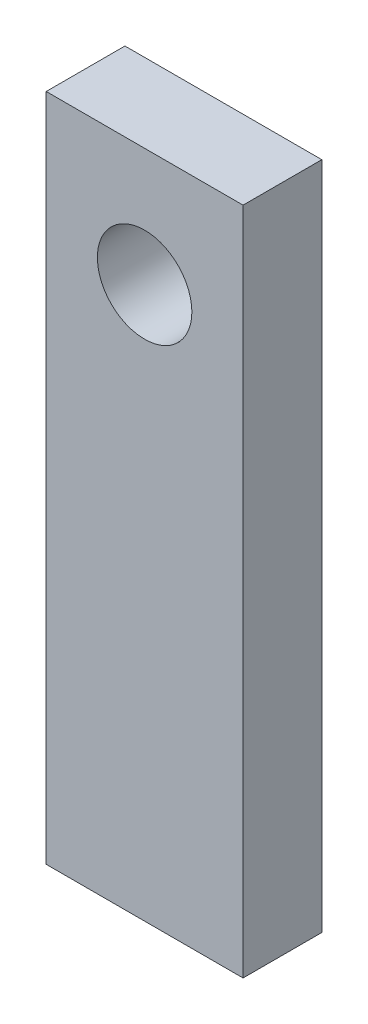
ISO-10303-21;
HEADER;
FILE_DESCRIPTION(('STEP AP214'),'2;1');
FILE_NAME('part.step','',(''),(''),'','','');
FILE_SCHEMA(('AUTOMOTIVE_DESIGN { 1 0 10303 214 1 1 1 1 }'));
ENDSEC;
DATA;
#1=APPLICATION_CONTEXT('core data for automotive mechanical design processes');
#2=APPLICATION_PROTOCOL_DEFINITION('international standard','automotive_design',2000,#1);
#3=PRODUCT_CONTEXT('',#1,'mechanical');
#4=PRODUCT('Part','Part','',(#3));
#5=PRODUCT_RELATED_PRODUCT_CATEGORY('part','',(#4));
#6=PRODUCT_DEFINITION_FORMATION('','',#4);
#7=PRODUCT_DEFINITION_CONTEXT('part definition',#1,'design');
#8=PRODUCT_DEFINITION('design','',#6,#7);
#9=PRODUCT_DEFINITION_SHAPE('','',#8);
#10=(LENGTH_UNIT() NAMED_UNIT(*) SI_UNIT(.MILLI.,.METRE.));
#11=(NAMED_UNIT(*) PLANE_ANGLE_UNIT() SI_UNIT($,.RADIAN.));
#12=(NAMED_UNIT(*) SI_UNIT($,.STERADIAN.) SOLID_ANGLE_UNIT());
#13=UNCERTAINTY_MEASURE_WITH_UNIT(LENGTH_MEASURE(1.E-05),#10,'distance_accuracy_value','');
#14=(GEOMETRIC_REPRESENTATION_CONTEXT(3) GLOBAL_UNCERTAINTY_ASSIGNED_CONTEXT((#13)) GLOBAL_UNIT_ASSIGNED_CONTEXT((#10,
#11,#12)) REPRESENTATION_CONTEXT('',''));
#15=CARTESIAN_POINT('',(0.,0.,0.));
#16=DIRECTION('',(0.,0.,1.));
#17=DIRECTION('',(1.,0.,0.));
#18=AXIS2_PLACEMENT_3D('',#15,#16,#17);
#19=CARTESIAN_POINT('',(0.,85.,0.));
#20=DIRECTION('',(1.,0.,0.));
#21=DIRECTION('',(0.,0.,-1.));
#22=AXIS2_PLACEMENT_3D('',#19,#20,#21);
#23=PLANE('',#22);
#24=DIRECTION('',(0.,0.,1.));
#25=VECTOR('',#24,1.);
#26=CARTESIAN_POINT('',(0.,0.,0.));
#27=LINE('',#26,#25);
#28=CARTESIAN_POINT('',(0.,0.,-10.));
#29=VERTEX_POINT('',#28);
#30=CARTESIAN_POINT('',(0.,0.,0.));
#31=VERTEX_POINT('',#30);
#32=EDGE_CURVE('E124',#29,#31,#27,.T.);
#33=ORIENTED_EDGE('',*,*,#32,.T.);
#34=DIRECTION('',(0.,-1.,0.));
#35=VECTOR('',#34,1.);
#36=CARTESIAN_POINT('',(0.,85.,0.));
#37=LINE('',#36,#35);
#38=CARTESIAN_POINT('',(0.,85.,0.));
#39=VERTEX_POINT('',#38);
#40=EDGE_CURVE('E11',#39,#31,#37,.T.);
#41=ORIENTED_EDGE('',*,*,#40,.F.);
#42=DIRECTION('',(0.,0.,1.));
#43=VECTOR('',#42,1.);
#44=CARTESIAN_POINT('',(0.,85.,0.));
#45=LINE('',#44,#43);
#46=CARTESIAN_POINT('',(0.,85.,-10.));
#47=VERTEX_POINT('',#46);
#48=EDGE_CURVE('E127',#47,#39,#45,.T.);
#49=ORIENTED_EDGE('',*,*,#48,.F.);
#50=DIRECTION('',(0.,-1.,0.));
#51=VECTOR('',#50,1.);
#52=CARTESIAN_POINT('',(0.,85.,-10.));
#53=LINE('',#52,#51);
#54=EDGE_CURVE('E133',#47,#29,#53,.T.);
#55=ORIENTED_EDGE('',*,*,#54,.T.);
#56=EDGE_LOOP('',(#33,#41,#49,#55));
#57=FACE_BOUND('',#56,.T.);
#58=ADVANCED_FACE('F45',(#57),#23,.F.);
#59=CARTESIAN_POINT('',(0.,85.,0.));
#60=DIRECTION('',(0.,0.,-1.));
#61=DIRECTION('',(-1.,0.,0.));
#62=AXIS2_PLACEMENT_3D('',#59,#60,#61);
#63=PLANE('',#62);
#64=CARTESIAN_POINT('',(12.5,70.,0.));
#65=DIRECTION('',(0.,0.,1.));
#66=DIRECTION('',(1.,0.,0.));
#67=AXIS2_PLACEMENT_3D('',#64,#65,#66);
#68=CIRCLE('',#67,6.);
#69=CARTESIAN_POINT('',(18.5,70.,0.));
#70=VERTEX_POINT('',#69);
#71=EDGE_CURVE('E120',#70,#70,#68,.T.);
#72=ORIENTED_EDGE('',*,*,#71,.F.);
#73=EDGE_LOOP('',(#72));
#74=FACE_BOUND('',#73,.T.);
#75=DIRECTION('',(1.,0.,0.));
#76=VECTOR('',#75,1.);
#77=CARTESIAN_POINT('',(0.,0.,0.));
#78=LINE('',#77,#76);
#79=CARTESIAN_POINT('',(25.,0.,0.));
#80=VERTEX_POINT('',#79);
#81=EDGE_CURVE('E136',#31,#80,#78,.T.);
#82=ORIENTED_EDGE('',*,*,#81,.T.);
#83=DIRECTION('',(0.,-1.,0.));
#84=VECTOR('',#83,1.);
#85=CARTESIAN_POINT('',(25.,85.,0.));
#86=LINE('',#85,#84);
#87=CARTESIAN_POINT('',(25.,85.,0.));
#88=VERTEX_POINT('',#87);
#89=EDGE_CURVE('E53',#88,#80,#86,.T.);
#90=ORIENTED_EDGE('',*,*,#89,.F.);
#91=DIRECTION('',(1.,0.,0.));
#92=VECTOR('',#91,1.);
#93=CARTESIAN_POINT('',(0.,85.,0.));
#94=LINE('',#93,#92);
#95=EDGE_CURVE('E92',#39,#88,#94,.T.);
#96=ORIENTED_EDGE('',*,*,#95,.F.);
#97=ORIENTED_EDGE('',*,*,#40,.T.);
#98=EDGE_LOOP('',(#82,#90,#96,#97));
#99=FACE_BOUND('',#98,.T.);
#100=ADVANCED_FACE('F162',(#74,#99),#63,.F.);
#101=CARTESIAN_POINT('',(25.,85.,0.));
#102=DIRECTION('',(-1.,0.,0.));
#103=DIRECTION('',(0.,0.,1.));
#104=AXIS2_PLACEMENT_3D('',#101,#102,#103);
#105=PLANE('',#104);
#106=DIRECTION('',(0.,0.,-1.));
#107=VECTOR('',#106,1.);
#108=CARTESIAN_POINT('',(25.,0.,0.));
#109=LINE('',#108,#107);
#110=CARTESIAN_POINT('',(25.,0.,-10.));
#111=VERTEX_POINT('',#110);
#112=EDGE_CURVE('E79',#80,#111,#109,.T.);
#113=ORIENTED_EDGE('',*,*,#112,.T.);
#114=DIRECTION('',(0.,-1.,0.));
#115=VECTOR('',#114,1.);
#116=CARTESIAN_POINT('',(25.,85.,-10.));
#117=LINE('',#116,#115);
#118=CARTESIAN_POINT('',(25.,85.,-10.));
#119=VERTEX_POINT('',#118);
#120=EDGE_CURVE('E141',#119,#111,#117,.T.);
#121=ORIENTED_EDGE('',*,*,#120,.F.);
#122=DIRECTION('',(0.,0.,-1.));
#123=VECTOR('',#122,1.);
#124=CARTESIAN_POINT('',(25.,85.,0.));
#125=LINE('',#124,#123);
#126=EDGE_CURVE('E130',#88,#119,#125,.T.);
#127=ORIENTED_EDGE('',*,*,#126,.F.);
#128=ORIENTED_EDGE('',*,*,#89,.T.);
#129=EDGE_LOOP('',(#113,#121,#127,#128));
#130=FACE_BOUND('',#129,.T.);
#131=ADVANCED_FACE('F143',(#130),#105,.F.);
#132=CARTESIAN_POINT('',(0.,85.,-10.));
#133=DIRECTION('',(0.,0.,1.));
#134=DIRECTION('',(1.,0.,0.));
#135=AXIS2_PLACEMENT_3D('',#132,#133,#134);
#136=PLANE('',#135);
#137=CARTESIAN_POINT('',(12.5,70.,-10.));
#138=DIRECTION('',(0.,0.,1.));
#139=DIRECTION('',(1.,0.,0.));
#140=AXIS2_PLACEMENT_3D('',#137,#138,#139);
#141=CIRCLE('',#140,6.);
#142=CARTESIAN_POINT('',(18.5,70.,-10.));
#143=VERTEX_POINT('',#142);
#144=EDGE_CURVE('E121',#143,#143,#141,.T.);
#145=ORIENTED_EDGE('',*,*,#144,.T.);
#146=EDGE_LOOP('',(#145));
#147=FACE_BOUND('',#146,.T.);
#148=DIRECTION('',(-1.,0.,0.));
#149=VECTOR('',#148,1.);
#150=CARTESIAN_POINT('',(0.,0.,-10.));
#151=LINE('',#150,#149);
#152=EDGE_CURVE('E85',#111,#29,#151,.T.);
#153=ORIENTED_EDGE('',*,*,#152,.T.);
#154=ORIENTED_EDGE('',*,*,#54,.F.);
#155=DIRECTION('',(-1.,0.,0.));
#156=VECTOR('',#155,1.);
#157=CARTESIAN_POINT('',(0.,85.,-10.));
#158=LINE('',#157,#156);
#159=EDGE_CURVE('E61',#119,#47,#158,.T.);
#160=ORIENTED_EDGE('',*,*,#159,.F.);
#161=ORIENTED_EDGE('',*,*,#120,.T.);
#162=EDGE_LOOP('',(#153,#154,#160,#161));
#163=FACE_BOUND('',#162,.T.);
#164=ADVANCED_FACE('F150',(#147,#163),#136,.F.);
#165=CARTESIAN_POINT('',(0.,85.,0.));
#166=DIRECTION('',(0.,-1.,0.));
#167=DIRECTION('',(0.,0.,-1.));
#168=AXIS2_PLACEMENT_3D('',#165,#166,#167);
#169=PLANE('',#168);
#170=ORIENTED_EDGE('',*,*,#48,.T.);
#171=ORIENTED_EDGE('',*,*,#95,.T.);
#172=ORIENTED_EDGE('',*,*,#126,.T.);
#173=ORIENTED_EDGE('',*,*,#159,.T.);
#174=EDGE_LOOP('',(#170,#171,#172,#173));
#175=FACE_BOUND('',#174,.T.);
#176=ADVANCED_FACE('F152',(#175),#169,.F.);
#177=CARTESIAN_POINT('',(0.,0.,0.));
#178=DIRECTION('',(0.,-1.,0.));
#179=DIRECTION('',(0.,0.,-1.));
#180=AXIS2_PLACEMENT_3D('',#177,#178,#179);
#181=PLANE('',#180);
#182=CARTESIAN_POINT('',(5.,0.,-5.));
#183=DIRECTION('',(0.,-1.,0.));
#184=DIRECTION('',(0.,0.,-1.));
#185=AXIS2_PLACEMENT_3D('',#182,#183,#184);
#186=CIRCLE('',#185,1.24999999999999);
#187=CARTESIAN_POINT('',(5.,0.,-6.24999999999999));
#188=VERTEX_POINT('',#187);
#189=EDGE_CURVE('E110',#188,#188,#186,.T.);
#190=ORIENTED_EDGE('',*,*,#189,.F.);
#191=EDGE_LOOP('',(#190));
#192=FACE_BOUND('',#191,.T.);
#193=CARTESIAN_POINT('',(20.,0.,-5.));
#194=DIRECTION('',(0.,-1.,0.));
#195=DIRECTION('',(0.,0.,-1.));
#196=AXIS2_PLACEMENT_3D('',#193,#194,#195);
#197=CIRCLE('',#196,1.24999999999999);
#198=CARTESIAN_POINT('',(20.,0.,-6.24999999999999));
#199=VERTEX_POINT('',#198);
#200=EDGE_CURVE('E109',#199,#199,#197,.T.);
#201=ORIENTED_EDGE('',*,*,#200,.F.);
#202=EDGE_LOOP('',(#201));
#203=FACE_BOUND('',#202,.T.);
#204=ORIENTED_EDGE('',*,*,#32,.F.);
#205=ORIENTED_EDGE('',*,*,#152,.F.);
#206=ORIENTED_EDGE('',*,*,#112,.F.);
#207=ORIENTED_EDGE('',*,*,#81,.F.);
#208=EDGE_LOOP('',(#204,#205,#206,#207));
#209=FACE_BOUND('',#208,.T.);
#210=ADVANCED_FACE('F146',(#192,#203,#209),#181,.T.);
#211=CARTESIAN_POINT('',(12.5,70.,-10.));
#212=DIRECTION('',(0.,0.,1.));
#213=DIRECTION('',(1.,0.,0.));
#214=AXIS2_PLACEMENT_3D('',#211,#212,#213);
#215=CYLINDRICAL_SURFACE('',#214,6.);
#216=ORIENTED_EDGE('',*,*,#144,.F.);
#217=EDGE_LOOP('',(#216));
#218=FACE_BOUND('',#217,.T.);
#219=ORIENTED_EDGE('',*,*,#71,.T.);
#220=EDGE_LOOP('',(#219));
#221=FACE_BOUND('',#220,.T.);
#222=ADVANCED_FACE('F173',(#218,#221),#215,.F.);
#223=CARTESIAN_POINT('',(20.,11.5,-5.));
#224=DIRECTION('',(0.,-1.,0.));
#225=DIRECTION('',(0.,0.,-1.));
#226=AXIS2_PLACEMENT_3D('',#223,#224,#225);
#227=CONICAL_SURFACE('',#226,1.24999999999999,1.02974425867665);
#228=CARTESIAN_POINT('',(20.,12.2510757737844,-5.));
#229=VERTEX_POINT('',#228);
#230=VERTEX_LOOP('',#229);
#231=FACE_BOUND('',#230,.T.);
#232=CARTESIAN_POINT('',(20.,11.5,-5.));
#233=DIRECTION('',(0.,-1.,0.));
#234=DIRECTION('',(0.,0.,-1.));
#235=AXIS2_PLACEMENT_3D('',#232,#233,#234);
#236=CIRCLE('',#235,1.24999999999999);
#237=CARTESIAN_POINT('',(20.,11.5,-6.24999999999999));
#238=VERTEX_POINT('',#237);
#239=EDGE_CURVE('E113',#238,#238,#236,.T.);
#240=ORIENTED_EDGE('',*,*,#239,.T.);
#241=EDGE_LOOP('',(#240));
#242=FACE_BOUND('',#241,.T.);
#243=ADVANCED_FACE('F174',(#231,#242),#227,.F.);
#244=CARTESIAN_POINT('',(20.,0.,-5.));
#245=DIRECTION('',(0.,-1.,0.));
#246=DIRECTION('',(0.,0.,-1.));
#247=AXIS2_PLACEMENT_3D('',#244,#245,#246);
#248=CYLINDRICAL_SURFACE('',#247,1.24999999999999);
#249=ORIENTED_EDGE('',*,*,#239,.F.);
#250=EDGE_LOOP('',(#249));
#251=FACE_BOUND('',#250,.T.);
#252=ORIENTED_EDGE('',*,*,#200,.T.);
#253=EDGE_LOOP('',(#252));
#254=FACE_BOUND('',#253,.T.);
#255=ADVANCED_FACE('F103',(#251,#254),#248,.F.);
#256=CARTESIAN_POINT('',(5.,11.5,-5.));
#257=DIRECTION('',(0.,-1.,0.));
#258=DIRECTION('',(0.,0.,-1.));
#259=AXIS2_PLACEMENT_3D('',#256,#257,#258);
#260=CONICAL_SURFACE('',#259,1.24999999999999,1.02974425867665);
#261=CARTESIAN_POINT('',(5.,12.2510757737844,-5.));
#262=VERTEX_POINT('',#261);
#263=VERTEX_LOOP('',#262);
#264=FACE_BOUND('',#263,.T.);
#265=CARTESIAN_POINT('',(5.,11.5,-5.));
#266=DIRECTION('',(0.,-1.,0.));
#267=DIRECTION('',(0.,0.,-1.));
#268=AXIS2_PLACEMENT_3D('',#265,#266,#267);
#269=CIRCLE('',#268,1.24999999999999);
#270=CARTESIAN_POINT('',(5.,11.5,-6.24999999999999));
#271=VERTEX_POINT('',#270);
#272=EDGE_CURVE('E107',#271,#271,#269,.T.);
#273=ORIENTED_EDGE('',*,*,#272,.T.);
#274=EDGE_LOOP('',(#273));
#275=FACE_BOUND('',#274,.T.);
#276=ADVANCED_FACE('F99',(#264,#275),#260,.F.);
#277=CARTESIAN_POINT('',(5.,0.,-5.));
#278=DIRECTION('',(0.,-1.,0.));
#279=DIRECTION('',(0.,0.,-1.));
#280=AXIS2_PLACEMENT_3D('',#277,#278,#279);
#281=CYLINDRICAL_SURFACE('',#280,1.24999999999999);
#282=ORIENTED_EDGE('',*,*,#272,.F.);
#283=EDGE_LOOP('',(#282));
#284=FACE_BOUND('',#283,.T.);
#285=ORIENTED_EDGE('',*,*,#189,.T.);
#286=EDGE_LOOP('',(#285));
#287=FACE_BOUND('',#286,.T.);
#288=ADVANCED_FACE('F102',(#284,#287),#281,.F.);
#289=CLOSED_SHELL('',(#58,#100,#131,#164,#176,#210,#222,#243,#255,#276,#288));
#290=MANIFOLD_SOLID_BREP('B2',#289);
#291=ADVANCED_BREP_SHAPE_REPRESENTATION('',(#18,#290),#14);
#292=SHAPE_DEFINITION_REPRESENTATION(#9,#291);
ENDSEC;
END-ISO-10303-21;
